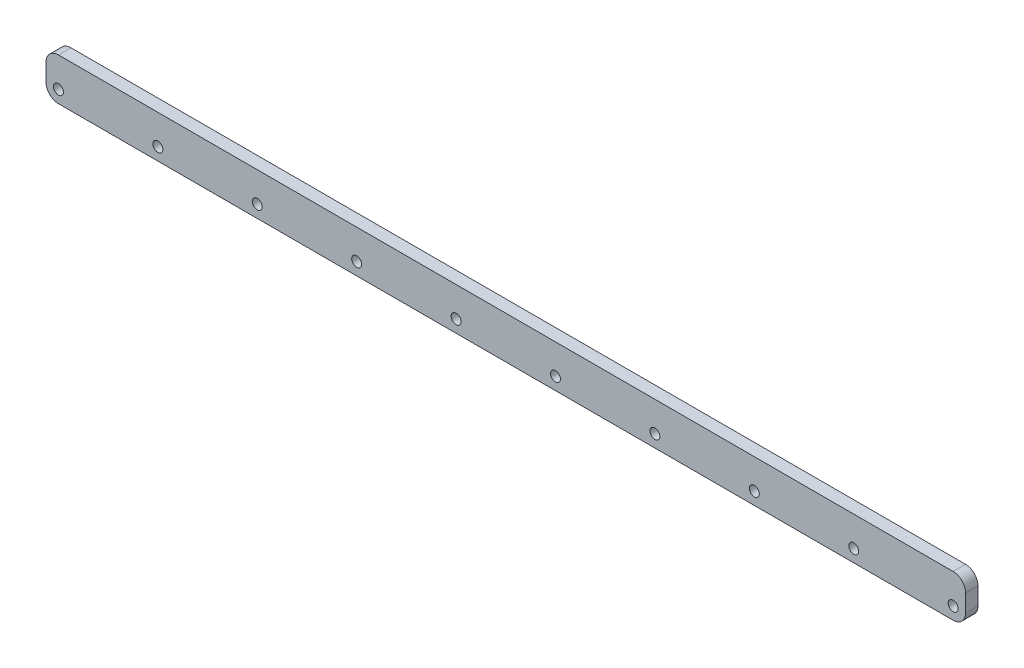
ISO-10303-21;
HEADER;
FILE_DESCRIPTION(('STEP AP214'),'2;1');
FILE_NAME('part.step','',(''),(''),'','','');
FILE_SCHEMA(('AUTOMOTIVE_DESIGN { 1 0 10303 214 1 1 1 1 }'));
ENDSEC;
DATA;
#1=APPLICATION_CONTEXT('core data for automotive mechanical design processes');
#2=APPLICATION_PROTOCOL_DEFINITION('international standard','automotive_design',2000,#1);
#3=PRODUCT_CONTEXT('',#1,'mechanical');
#4=PRODUCT('Part','Part','',(#3));
#5=PRODUCT_RELATED_PRODUCT_CATEGORY('part','',(#4));
#6=PRODUCT_DEFINITION_FORMATION('','',#4);
#7=PRODUCT_DEFINITION_CONTEXT('part definition',#1,'design');
#8=PRODUCT_DEFINITION('design','',#6,#7);
#9=PRODUCT_DEFINITION_SHAPE('','',#8);
#10=(LENGTH_UNIT() NAMED_UNIT(*) SI_UNIT(.MILLI.,.METRE.));
#11=(NAMED_UNIT(*) PLANE_ANGLE_UNIT() SI_UNIT($,.RADIAN.));
#12=(NAMED_UNIT(*) SI_UNIT($,.STERADIAN.) SOLID_ANGLE_UNIT());
#13=UNCERTAINTY_MEASURE_WITH_UNIT(LENGTH_MEASURE(1.E-05),#10,'distance_accuracy_value','');
#14=(GEOMETRIC_REPRESENTATION_CONTEXT(3) GLOBAL_UNCERTAINTY_ASSIGNED_CONTEXT((#13)) GLOBAL_UNIT_ASSIGNED_CONTEXT((#10,
#11,#12)) REPRESENTATION_CONTEXT('',''));
#15=CARTESIAN_POINT('',(0.,0.,0.));
#16=DIRECTION('',(0.,0.,1.));
#17=DIRECTION('',(1.,0.,0.));
#18=AXIS2_PLACEMENT_3D('',#15,#16,#17);
#19=CARTESIAN_POINT('',(0.,0.,5.));
#20=DIRECTION('',(0.,0.,-1.));
#21=DIRECTION('',(-1.,0.,0.));
#22=AXIS2_PLACEMENT_3D('',#19,#20,#21);
#23=PLANE('',#22);
#24=DIRECTION('',(1.,0.,0.));
#25=VECTOR('',#24,1.);
#26=CARTESIAN_POINT('',(0.,0.,5.));
#27=LINE('',#26,#25);
#28=CARTESIAN_POINT('',(5.,0.,5.));
#29=VERTEX_POINT('',#28);
#30=CARTESIAN_POINT('',(365.,0.,5.));
#31=VERTEX_POINT('',#30);
#32=EDGE_CURVE('E194',#29,#31,#27,.T.);
#33=ORIENTED_EDGE('',*,*,#32,.T.);
#34=CARTESIAN_POINT('',(365.,5.,5.));
#35=DIRECTION('',(0.,0.,-1.));
#36=DIRECTION('',(-1.,0.,0.));
#37=AXIS2_PLACEMENT_3D('',#34,#35,#36);
#38=CIRCLE('',#37,5.);
#39=CARTESIAN_POINT('',(370.,5.,5.));
#40=VERTEX_POINT('',#39);
#41=EDGE_CURVE('E156',#31,#40,#38,.F.);
#42=ORIENTED_EDGE('',*,*,#41,.T.);
#43=DIRECTION('',(0.,1.,0.));
#44=VECTOR('',#43,1.);
#45=CARTESIAN_POINT('',(370.,0.,5.));
#46=LINE('',#45,#44);
#47=CARTESIAN_POINT('',(370.,12.,5.));
#48=VERTEX_POINT('',#47);
#49=EDGE_CURVE('E123',#40,#48,#46,.T.);
#50=ORIENTED_EDGE('',*,*,#49,.T.);
#51=CARTESIAN_POINT('',(365.,12.,5.));
#52=DIRECTION('',(0.,0.,-1.));
#53=DIRECTION('',(-1.,0.,0.));
#54=AXIS2_PLACEMENT_3D('',#51,#52,#53);
#55=CIRCLE('',#54,5.);
#56=CARTESIAN_POINT('',(365.,17.,5.));
#57=VERTEX_POINT('',#56);
#58=EDGE_CURVE('E60',#48,#57,#55,.F.);
#59=ORIENTED_EDGE('',*,*,#58,.T.);
#60=DIRECTION('',(-1.,0.,0.));
#61=VECTOR('',#60,1.);
#62=CARTESIAN_POINT('',(0.,17.,5.));
#63=LINE('',#62,#61);
#64=CARTESIAN_POINT('',(5.,17.,5.));
#65=VERTEX_POINT('',#64);
#66=EDGE_CURVE('E139',#57,#65,#63,.T.);
#67=ORIENTED_EDGE('',*,*,#66,.T.);
#68=CARTESIAN_POINT('',(5.,12.,5.));
#69=DIRECTION('',(0.,0.,-1.));
#70=DIRECTION('',(-1.,0.,0.));
#71=AXIS2_PLACEMENT_3D('',#68,#69,#70);
#72=CIRCLE('',#71,5.);
#73=CARTESIAN_POINT('',(0.,12.,5.));
#74=VERTEX_POINT('',#73);
#75=EDGE_CURVE('E148',#65,#74,#72,.F.);
#76=ORIENTED_EDGE('',*,*,#75,.T.);
#77=DIRECTION('',(0.,-1.,0.));
#78=VECTOR('',#77,1.);
#79=CARTESIAN_POINT('',(0.,0.,5.));
#80=LINE('',#79,#78);
#81=CARTESIAN_POINT('',(0.,5.,5.));
#82=VERTEX_POINT('',#81);
#83=EDGE_CURVE('E133',#74,#82,#80,.T.);
#84=ORIENTED_EDGE('',*,*,#83,.T.);
#85=CARTESIAN_POINT('',(5.,5.,5.));
#86=DIRECTION('',(0.,0.,-1.));
#87=DIRECTION('',(-1.,0.,0.));
#88=AXIS2_PLACEMENT_3D('',#85,#86,#87);
#89=CIRCLE('',#88,5.);
#90=EDGE_CURVE('E151',#82,#29,#89,.F.);
#91=ORIENTED_EDGE('',*,*,#90,.T.);
#92=EDGE_LOOP('',(#33,#42,#50,#59,#67,#76,#84,#91));
#93=FACE_BOUND('',#92,.T.);
#94=CARTESIAN_POINT('',(5.,5.,5.));
#95=DIRECTION('',(0.,0.,1.));
#96=DIRECTION('',(1.,0.,0.));
#97=AXIS2_PLACEMENT_3D('',#94,#95,#96);
#98=CIRCLE('',#97,2.);
#99=CARTESIAN_POINT('',(7.,5.,5.));
#100=VERTEX_POINT('',#99);
#101=EDGE_CURVE('E173',#100,#100,#98,.T.);
#102=ORIENTED_EDGE('',*,*,#101,.F.);
#103=EDGE_LOOP('',(#102));
#104=FACE_BOUND('',#103,.T.);
#105=CARTESIAN_POINT('',(45.,5.,5.));
#106=DIRECTION('',(0.,0.,1.));
#107=DIRECTION('',(1.,0.,0.));
#108=AXIS2_PLACEMENT_3D('',#105,#106,#107);
#109=CIRCLE('',#108,2.);
#110=CARTESIAN_POINT('',(47.,5.,5.));
#111=VERTEX_POINT('',#110);
#112=EDGE_CURVE('E393',#111,#111,#109,.T.);
#113=ORIENTED_EDGE('',*,*,#112,.F.);
#114=EDGE_LOOP('',(#113));
#115=FACE_BOUND('',#114,.T.);
#116=CARTESIAN_POINT('',(85.,5.,5.));
#117=DIRECTION('',(0.,0.,1.));
#118=DIRECTION('',(1.,0.,0.));
#119=AXIS2_PLACEMENT_3D('',#116,#117,#118);
#120=CIRCLE('',#119,2.);
#121=CARTESIAN_POINT('',(87.,5.,5.));
#122=VERTEX_POINT('',#121);
#123=EDGE_CURVE('E401',#122,#122,#120,.T.);
#124=ORIENTED_EDGE('',*,*,#123,.F.);
#125=EDGE_LOOP('',(#124));
#126=FACE_BOUND('',#125,.T.);
#127=CARTESIAN_POINT('',(125.,5.,5.));
#128=DIRECTION('',(0.,0.,1.));
#129=DIRECTION('',(1.,0.,0.));
#130=AXIS2_PLACEMENT_3D('',#127,#128,#129);
#131=CIRCLE('',#130,2.);
#132=CARTESIAN_POINT('',(127.,5.,5.));
#133=VERTEX_POINT('',#132);
#134=EDGE_CURVE('E416',#133,#133,#131,.T.);
#135=ORIENTED_EDGE('',*,*,#134,.F.);
#136=EDGE_LOOP('',(#135));
#137=FACE_BOUND('',#136,.T.);
#138=CARTESIAN_POINT('',(165.,5.,5.));
#139=DIRECTION('',(0.,0.,1.));
#140=DIRECTION('',(1.,0.,0.));
#141=AXIS2_PLACEMENT_3D('',#138,#139,#140);
#142=CIRCLE('',#141,2.);
#143=CARTESIAN_POINT('',(167.,5.,5.));
#144=VERTEX_POINT('',#143);
#145=EDGE_CURVE('E417',#144,#144,#142,.T.);
#146=ORIENTED_EDGE('',*,*,#145,.F.);
#147=EDGE_LOOP('',(#146));
#148=FACE_BOUND('',#147,.T.);
#149=CARTESIAN_POINT('',(205.,5.,5.));
#150=DIRECTION('',(0.,0.,1.));
#151=DIRECTION('',(1.,0.,0.));
#152=AXIS2_PLACEMENT_3D('',#149,#150,#151);
#153=CIRCLE('',#152,2.);
#154=CARTESIAN_POINT('',(207.,5.,5.));
#155=VERTEX_POINT('',#154);
#156=EDGE_CURVE('E425',#155,#155,#153,.T.);
#157=ORIENTED_EDGE('',*,*,#156,.F.);
#158=EDGE_LOOP('',(#157));
#159=FACE_BOUND('',#158,.T.);
#160=CARTESIAN_POINT('',(245.,5.,5.));
#161=DIRECTION('',(0.,0.,1.));
#162=DIRECTION('',(1.,0.,0.));
#163=AXIS2_PLACEMENT_3D('',#160,#161,#162);
#164=CIRCLE('',#163,2.);
#165=CARTESIAN_POINT('',(247.,5.,5.));
#166=VERTEX_POINT('',#165);
#167=EDGE_CURVE('E442',#166,#166,#164,.T.);
#168=ORIENTED_EDGE('',*,*,#167,.F.);
#169=EDGE_LOOP('',(#168));
#170=FACE_BOUND('',#169,.T.);
#171=CARTESIAN_POINT('',(285.,5.,5.));
#172=DIRECTION('',(0.,0.,1.));
#173=DIRECTION('',(1.,0.,0.));
#174=AXIS2_PLACEMENT_3D('',#171,#172,#173);
#175=CIRCLE('',#174,2.);
#176=CARTESIAN_POINT('',(287.,5.,5.));
#177=VERTEX_POINT('',#176);
#178=EDGE_CURVE('E443',#177,#177,#175,.T.);
#179=ORIENTED_EDGE('',*,*,#178,.F.);
#180=EDGE_LOOP('',(#179));
#181=FACE_BOUND('',#180,.T.);
#182=CARTESIAN_POINT('',(325.,5.,5.));
#183=DIRECTION('',(0.,0.,1.));
#184=DIRECTION('',(1.,0.,0.));
#185=AXIS2_PLACEMENT_3D('',#182,#183,#184);
#186=CIRCLE('',#185,2.);
#187=CARTESIAN_POINT('',(327.,5.,5.));
#188=VERTEX_POINT('',#187);
#189=EDGE_CURVE('E451',#188,#188,#186,.T.);
#190=ORIENTED_EDGE('',*,*,#189,.F.);
#191=EDGE_LOOP('',(#190));
#192=FACE_BOUND('',#191,.T.);
#193=CARTESIAN_POINT('',(365.,5.,5.));
#194=DIRECTION('',(0.,0.,1.));
#195=DIRECTION('',(1.,0.,0.));
#196=AXIS2_PLACEMENT_3D('',#193,#194,#195);
#197=CIRCLE('',#196,2.);
#198=CARTESIAN_POINT('',(367.,5.,5.));
#199=VERTEX_POINT('',#198);
#200=EDGE_CURVE('E464',#199,#199,#197,.T.);
#201=ORIENTED_EDGE('',*,*,#200,.F.);
#202=EDGE_LOOP('',(#201));
#203=FACE_BOUND('',#202,.T.);
#204=ADVANCED_FACE('F38',(#93,#104,#115,#126,#137,#148,#159,#170,#181,#192,#203),#23,.F.);
#205=CARTESIAN_POINT('',(0.,0.,0.));
#206=DIRECTION('',(0.,0.,-1.));
#207=DIRECTION('',(-1.,0.,0.));
#208=AXIS2_PLACEMENT_3D('',#205,#206,#207);
#209=PLANE('',#208);
#210=CARTESIAN_POINT('',(325.,5.,0.));
#211=DIRECTION('',(0.,0.,1.));
#212=DIRECTION('',(1.,0.,0.));
#213=AXIS2_PLACEMENT_3D('',#210,#211,#212);
#214=CIRCLE('',#213,2.);
#215=CARTESIAN_POINT('',(327.,5.,0.));
#216=VERTEX_POINT('',#215);
#217=EDGE_CURVE('E456',#216,#216,#214,.T.);
#218=ORIENTED_EDGE('',*,*,#217,.T.);
#219=EDGE_LOOP('',(#218));
#220=FACE_BOUND('',#219,.T.);
#221=CARTESIAN_POINT('',(245.,5.,0.));
#222=DIRECTION('',(0.,0.,1.));
#223=DIRECTION('',(1.,0.,0.));
#224=AXIS2_PLACEMENT_3D('',#221,#222,#223);
#225=CIRCLE('',#224,2.);
#226=CARTESIAN_POINT('',(247.,5.,0.));
#227=VERTEX_POINT('',#226);
#228=EDGE_CURVE('E440',#227,#227,#225,.T.);
#229=ORIENTED_EDGE('',*,*,#228,.T.);
#230=EDGE_LOOP('',(#229));
#231=FACE_BOUND('',#230,.T.);
#232=CARTESIAN_POINT('',(165.,5.,0.));
#233=DIRECTION('',(0.,0.,1.));
#234=DIRECTION('',(1.,0.,0.));
#235=AXIS2_PLACEMENT_3D('',#232,#233,#234);
#236=CIRCLE('',#235,2.);
#237=CARTESIAN_POINT('',(167.,5.,0.));
#238=VERTEX_POINT('',#237);
#239=EDGE_CURVE('E422',#238,#238,#236,.T.);
#240=ORIENTED_EDGE('',*,*,#239,.T.);
#241=EDGE_LOOP('',(#240));
#242=FACE_BOUND('',#241,.T.);
#243=CARTESIAN_POINT('',(85.,5.,0.));
#244=DIRECTION('',(0.,0.,1.));
#245=DIRECTION('',(1.,0.,0.));
#246=AXIS2_PLACEMENT_3D('',#243,#244,#245);
#247=CIRCLE('',#246,2.);
#248=CARTESIAN_POINT('',(87.,5.,0.));
#249=VERTEX_POINT('',#248);
#250=EDGE_CURVE('E405',#249,#249,#247,.T.);
#251=ORIENTED_EDGE('',*,*,#250,.T.);
#252=EDGE_LOOP('',(#251));
#253=FACE_BOUND('',#252,.T.);
#254=CARTESIAN_POINT('',(5.,5.,0.));
#255=DIRECTION('',(0.,0.,1.));
#256=DIRECTION('',(1.,0.,0.));
#257=AXIS2_PLACEMENT_3D('',#254,#255,#256);
#258=CIRCLE('',#257,2.);
#259=CARTESIAN_POINT('',(7.,5.,0.));
#260=VERTEX_POINT('',#259);
#261=EDGE_CURVE('E176',#260,#260,#258,.T.);
#262=ORIENTED_EDGE('',*,*,#261,.T.);
#263=EDGE_LOOP('',(#262));
#264=FACE_BOUND('',#263,.T.);
#265=DIRECTION('',(0.,1.,0.));
#266=VECTOR('',#265,1.);
#267=CARTESIAN_POINT('',(370.,0.,0.));
#268=LINE('',#267,#266);
#269=CARTESIAN_POINT('',(370.,5.,0.));
#270=VERTEX_POINT('',#269);
#271=CARTESIAN_POINT('',(370.,12.,0.));
#272=VERTEX_POINT('',#271);
#273=EDGE_CURVE('E121',#270,#272,#268,.T.);
#274=ORIENTED_EDGE('',*,*,#273,.F.);
#275=CARTESIAN_POINT('',(365.,5.,0.));
#276=DIRECTION('',(0.,0.,-1.));
#277=DIRECTION('',(-1.,0.,0.));
#278=AXIS2_PLACEMENT_3D('',#275,#276,#277);
#279=CIRCLE('',#278,5.);
#280=CARTESIAN_POINT('',(365.,0.,0.));
#281=VERTEX_POINT('',#280);
#282=EDGE_CURVE('E104',#270,#281,#279,.T.);
#283=ORIENTED_EDGE('',*,*,#282,.T.);
#284=DIRECTION('',(1.,0.,0.));
#285=VECTOR('',#284,1.);
#286=CARTESIAN_POINT('',(0.,0.,0.));
#287=LINE('',#286,#285);
#288=CARTESIAN_POINT('',(5.,0.,0.));
#289=VERTEX_POINT('',#288);
#290=EDGE_CURVE('E131',#289,#281,#287,.T.);
#291=ORIENTED_EDGE('',*,*,#290,.F.);
#292=CARTESIAN_POINT('',(5.,5.,0.));
#293=DIRECTION('',(0.,0.,-1.));
#294=DIRECTION('',(-1.,0.,0.));
#295=AXIS2_PLACEMENT_3D('',#292,#293,#294);
#296=CIRCLE('',#295,5.);
#297=CARTESIAN_POINT('',(0.,5.,0.));
#298=VERTEX_POINT('',#297);
#299=EDGE_CURVE('E142',#289,#298,#296,.T.);
#300=ORIENTED_EDGE('',*,*,#299,.T.);
#301=DIRECTION('',(0.,-1.,0.));
#302=VECTOR('',#301,1.);
#303=CARTESIAN_POINT('',(0.,0.,0.));
#304=LINE('',#303,#302);
#305=CARTESIAN_POINT('',(0.,12.,0.));
#306=VERTEX_POINT('',#305);
#307=EDGE_CURVE('E135',#306,#298,#304,.T.);
#308=ORIENTED_EDGE('',*,*,#307,.F.);
#309=CARTESIAN_POINT('',(5.,12.,0.));
#310=DIRECTION('',(0.,0.,-1.));
#311=DIRECTION('',(-1.,0.,0.));
#312=AXIS2_PLACEMENT_3D('',#309,#310,#311);
#313=CIRCLE('',#312,5.);
#314=CARTESIAN_POINT('',(5.,17.,0.));
#315=VERTEX_POINT('',#314);
#316=EDGE_CURVE('E124',#306,#315,#313,.T.);
#317=ORIENTED_EDGE('',*,*,#316,.T.);
#318=DIRECTION('',(-1.,0.,0.));
#319=VECTOR('',#318,1.);
#320=CARTESIAN_POINT('',(0.,17.,0.));
#321=LINE('',#320,#319);
#322=CARTESIAN_POINT('',(365.,17.,0.));
#323=VERTEX_POINT('',#322);
#324=EDGE_CURVE('E130',#323,#315,#321,.T.);
#325=ORIENTED_EDGE('',*,*,#324,.F.);
#326=CARTESIAN_POINT('',(365.,12.,0.));
#327=DIRECTION('',(0.,0.,-1.));
#328=DIRECTION('',(-1.,0.,0.));
#329=AXIS2_PLACEMENT_3D('',#326,#327,#328);
#330=CIRCLE('',#329,5.);
#331=EDGE_CURVE('E115',#323,#272,#330,.T.);
#332=ORIENTED_EDGE('',*,*,#331,.T.);
#333=EDGE_LOOP('',(#274,#283,#291,#300,#308,#317,#325,#332));
#334=FACE_BOUND('',#333,.T.);
#335=CARTESIAN_POINT('',(45.,5.,0.));
#336=DIRECTION('',(0.,0.,1.));
#337=DIRECTION('',(1.,0.,0.));
#338=AXIS2_PLACEMENT_3D('',#335,#336,#337);
#339=CIRCLE('',#338,2.);
#340=CARTESIAN_POINT('',(47.,5.,0.));
#341=VERTEX_POINT('',#340);
#342=EDGE_CURVE('E396',#341,#341,#339,.T.);
#343=ORIENTED_EDGE('',*,*,#342,.T.);
#344=EDGE_LOOP('',(#343));
#345=FACE_BOUND('',#344,.T.);
#346=CARTESIAN_POINT('',(125.,5.,0.));
#347=DIRECTION('',(0.,0.,1.));
#348=DIRECTION('',(1.,0.,0.));
#349=AXIS2_PLACEMENT_3D('',#346,#347,#348);
#350=CIRCLE('',#349,2.);
#351=CARTESIAN_POINT('',(127.,5.,0.));
#352=VERTEX_POINT('',#351);
#353=EDGE_CURVE('E414',#352,#352,#350,.T.);
#354=ORIENTED_EDGE('',*,*,#353,.T.);
#355=EDGE_LOOP('',(#354));
#356=FACE_BOUND('',#355,.T.);
#357=CARTESIAN_POINT('',(205.,5.,0.));
#358=DIRECTION('',(0.,0.,1.));
#359=DIRECTION('',(1.,0.,0.));
#360=AXIS2_PLACEMENT_3D('',#357,#358,#359);
#361=CIRCLE('',#360,2.);
#362=CARTESIAN_POINT('',(207.,5.,0.));
#363=VERTEX_POINT('',#362);
#364=EDGE_CURVE('E430',#363,#363,#361,.T.);
#365=ORIENTED_EDGE('',*,*,#364,.T.);
#366=EDGE_LOOP('',(#365));
#367=FACE_BOUND('',#366,.T.);
#368=CARTESIAN_POINT('',(285.,5.,0.));
#369=DIRECTION('',(0.,0.,1.));
#370=DIRECTION('',(1.,0.,0.));
#371=AXIS2_PLACEMENT_3D('',#368,#369,#370);
#372=CIRCLE('',#371,2.);
#373=CARTESIAN_POINT('',(287.,5.,0.));
#374=VERTEX_POINT('',#373);
#375=EDGE_CURVE('E448',#374,#374,#372,.T.);
#376=ORIENTED_EDGE('',*,*,#375,.T.);
#377=EDGE_LOOP('',(#376));
#378=FACE_BOUND('',#377,.T.);
#379=CARTESIAN_POINT('',(365.,5.,0.));
#380=DIRECTION('',(0.,0.,1.));
#381=DIRECTION('',(1.,0.,0.));
#382=AXIS2_PLACEMENT_3D('',#379,#380,#381);
#383=CIRCLE('',#382,2.);
#384=CARTESIAN_POINT('',(367.,5.,0.));
#385=VERTEX_POINT('',#384);
#386=EDGE_CURVE('E462',#385,#385,#383,.T.);
#387=ORIENTED_EDGE('',*,*,#386,.T.);
#388=EDGE_LOOP('',(#387));
#389=FACE_BOUND('',#388,.T.);
#390=ADVANCED_FACE('F127',(#220,#231,#242,#253,#264,#334,#345,#356,#367,#378,#389),#209,.T.);
#391=CARTESIAN_POINT('',(0.,0.,5.));
#392=DIRECTION('',(1.,0.,0.));
#393=DIRECTION('',(0.,0.,-1.));
#394=AXIS2_PLACEMENT_3D('',#391,#392,#393);
#395=PLANE('',#394);
#396=ORIENTED_EDGE('',*,*,#307,.T.);
#397=DIRECTION('',(0.,0.,-1.));
#398=VECTOR('',#397,1.);
#399=CARTESIAN_POINT('',(0.,5.,5.));
#400=LINE('',#399,#398);
#401=EDGE_CURVE('E12',#298,#82,#400,.F.);
#402=ORIENTED_EDGE('',*,*,#401,.T.);
#403=ORIENTED_EDGE('',*,*,#83,.F.);
#404=DIRECTION('',(0.,0.,-1.));
#405=VECTOR('',#404,1.);
#406=CARTESIAN_POINT('',(0.,12.,5.));
#407=LINE('',#406,#405);
#408=EDGE_CURVE('E46',#74,#306,#407,.T.);
#409=ORIENTED_EDGE('',*,*,#408,.T.);
#410=EDGE_LOOP('',(#396,#402,#403,#409));
#411=FACE_BOUND('',#410,.T.);
#412=ADVANCED_FACE('F168',(#411),#395,.F.);
#413=CARTESIAN_POINT('',(0.,0.,5.));
#414=DIRECTION('',(0.,1.,0.));
#415=DIRECTION('',(0.,0.,1.));
#416=AXIS2_PLACEMENT_3D('',#413,#414,#415);
#417=PLANE('',#416);
#418=ORIENTED_EDGE('',*,*,#290,.T.);
#419=DIRECTION('',(0.,0.,-1.));
#420=VECTOR('',#419,1.);
#421=CARTESIAN_POINT('',(365.,0.,5.));
#422=LINE('',#421,#420);
#423=EDGE_CURVE('E109',#281,#31,#422,.F.);
#424=ORIENTED_EDGE('',*,*,#423,.T.);
#425=ORIENTED_EDGE('',*,*,#32,.F.);
#426=DIRECTION('',(0.,0.,-1.));
#427=VECTOR('',#426,1.);
#428=CARTESIAN_POINT('',(5.,0.,5.));
#429=LINE('',#428,#427);
#430=EDGE_CURVE('E114',#29,#289,#429,.T.);
#431=ORIENTED_EDGE('',*,*,#430,.T.);
#432=EDGE_LOOP('',(#418,#424,#425,#431));
#433=FACE_BOUND('',#432,.T.);
#434=ADVANCED_FACE('F226',(#433),#417,.F.);
#435=CARTESIAN_POINT('',(370.,0.,5.));
#436=DIRECTION('',(-1.,0.,0.));
#437=DIRECTION('',(0.,0.,1.));
#438=AXIS2_PLACEMENT_3D('',#435,#436,#437);
#439=PLANE('',#438);
#440=ORIENTED_EDGE('',*,*,#49,.F.);
#441=DIRECTION('',(0.,0.,-1.));
#442=VECTOR('',#441,1.);
#443=CARTESIAN_POINT('',(370.,5.,5.));
#444=LINE('',#443,#442);
#445=EDGE_CURVE('E108',#40,#270,#444,.T.);
#446=ORIENTED_EDGE('',*,*,#445,.T.);
#447=ORIENTED_EDGE('',*,*,#273,.T.);
#448=DIRECTION('',(0.,0.,-1.));
#449=VECTOR('',#448,1.);
#450=CARTESIAN_POINT('',(370.,12.,5.));
#451=LINE('',#450,#449);
#452=EDGE_CURVE('E125',#272,#48,#451,.F.);
#453=ORIENTED_EDGE('',*,*,#452,.T.);
#454=EDGE_LOOP('',(#440,#446,#447,#453));
#455=FACE_BOUND('',#454,.T.);
#456=ADVANCED_FACE('F120',(#455),#439,.F.);
#457=CARTESIAN_POINT('',(0.,17.,5.));
#458=DIRECTION('',(0.,-1.,0.));
#459=DIRECTION('',(0.,0.,-1.));
#460=AXIS2_PLACEMENT_3D('',#457,#458,#459);
#461=PLANE('',#460);
#462=ORIENTED_EDGE('',*,*,#66,.F.);
#463=DIRECTION('',(0.,0.,-1.));
#464=VECTOR('',#463,1.);
#465=CARTESIAN_POINT('',(365.,17.,5.));
#466=LINE('',#465,#464);
#467=EDGE_CURVE('E160',#57,#323,#466,.T.);
#468=ORIENTED_EDGE('',*,*,#467,.T.);
#469=ORIENTED_EDGE('',*,*,#324,.T.);
#470=DIRECTION('',(0.,0.,-1.));
#471=VECTOR('',#470,1.);
#472=CARTESIAN_POINT('',(5.,17.,5.));
#473=LINE('',#472,#471);
#474=EDGE_CURVE('E53',#315,#65,#473,.F.);
#475=ORIENTED_EDGE('',*,*,#474,.T.);
#476=EDGE_LOOP('',(#462,#468,#469,#475));
#477=FACE_BOUND('',#476,.T.);
#478=ADVANCED_FACE('F204',(#477),#461,.F.);
#479=CARTESIAN_POINT('',(5.,5.,5.));
#480=DIRECTION('',(0.,0.,-1.));
#481=DIRECTION('',(-1.,0.,0.));
#482=AXIS2_PLACEMENT_3D('',#479,#480,#481);
#483=CYLINDRICAL_SURFACE('',#482,2.);
#484=ORIENTED_EDGE('',*,*,#101,.T.);
#485=EDGE_LOOP('',(#484));
#486=FACE_BOUND('',#485,.T.);
#487=ORIENTED_EDGE('',*,*,#261,.F.);
#488=EDGE_LOOP('',(#487));
#489=FACE_BOUND('',#488,.T.);
#490=ADVANCED_FACE('F219',(#486,#489),#483,.F.);
#491=CARTESIAN_POINT('',(45.,5.,5.));
#492=DIRECTION('',(0.,0.,-1.));
#493=DIRECTION('',(-1.,0.,0.));
#494=AXIS2_PLACEMENT_3D('',#491,#492,#493);
#495=CYLINDRICAL_SURFACE('',#494,2.);
#496=ORIENTED_EDGE('',*,*,#112,.T.);
#497=EDGE_LOOP('',(#496));
#498=FACE_BOUND('',#497,.T.);
#499=ORIENTED_EDGE('',*,*,#342,.F.);
#500=EDGE_LOOP('',(#499));
#501=FACE_BOUND('',#500,.T.);
#502=ADVANCED_FACE('F328',(#498,#501),#495,.F.);
#503=CARTESIAN_POINT('',(85.,5.,5.));
#504=DIRECTION('',(0.,0.,-1.));
#505=DIRECTION('',(-1.,0.,0.));
#506=AXIS2_PLACEMENT_3D('',#503,#504,#505);
#507=CYLINDRICAL_SURFACE('',#506,2.);
#508=ORIENTED_EDGE('',*,*,#123,.T.);
#509=EDGE_LOOP('',(#508));
#510=FACE_BOUND('',#509,.T.);
#511=ORIENTED_EDGE('',*,*,#250,.F.);
#512=EDGE_LOOP('',(#511));
#513=FACE_BOUND('',#512,.T.);
#514=ADVANCED_FACE('F319',(#510,#513),#507,.F.);
#515=CARTESIAN_POINT('',(125.,5.,5.));
#516=DIRECTION('',(0.,0.,-1.));
#517=DIRECTION('',(-1.,0.,0.));
#518=AXIS2_PLACEMENT_3D('',#515,#516,#517);
#519=CYLINDRICAL_SURFACE('',#518,2.);
#520=ORIENTED_EDGE('',*,*,#134,.T.);
#521=EDGE_LOOP('',(#520));
#522=FACE_BOUND('',#521,.T.);
#523=ORIENTED_EDGE('',*,*,#353,.F.);
#524=EDGE_LOOP('',(#523));
#525=FACE_BOUND('',#524,.T.);
#526=ADVANCED_FACE('F310',(#522,#525),#519,.F.);
#527=CARTESIAN_POINT('',(165.,5.,5.));
#528=DIRECTION('',(0.,0.,-1.));
#529=DIRECTION('',(-1.,0.,0.));
#530=AXIS2_PLACEMENT_3D('',#527,#528,#529);
#531=CYLINDRICAL_SURFACE('',#530,2.);
#532=ORIENTED_EDGE('',*,*,#145,.T.);
#533=EDGE_LOOP('',(#532));
#534=FACE_BOUND('',#533,.T.);
#535=ORIENTED_EDGE('',*,*,#239,.F.);
#536=EDGE_LOOP('',(#535));
#537=FACE_BOUND('',#536,.T.);
#538=ADVANCED_FACE('F301',(#534,#537),#531,.F.);
#539=CARTESIAN_POINT('',(205.,5.,5.));
#540=DIRECTION('',(0.,0.,-1.));
#541=DIRECTION('',(-1.,0.,0.));
#542=AXIS2_PLACEMENT_3D('',#539,#540,#541);
#543=CYLINDRICAL_SURFACE('',#542,2.);
#544=ORIENTED_EDGE('',*,*,#156,.T.);
#545=EDGE_LOOP('',(#544));
#546=FACE_BOUND('',#545,.T.);
#547=ORIENTED_EDGE('',*,*,#364,.F.);
#548=EDGE_LOOP('',(#547));
#549=FACE_BOUND('',#548,.T.);
#550=ADVANCED_FACE('F292',(#546,#549),#543,.F.);
#551=CARTESIAN_POINT('',(245.,5.,5.));
#552=DIRECTION('',(0.,0.,-1.));
#553=DIRECTION('',(-1.,0.,0.));
#554=AXIS2_PLACEMENT_3D('',#551,#552,#553);
#555=CYLINDRICAL_SURFACE('',#554,2.);
#556=ORIENTED_EDGE('',*,*,#167,.T.);
#557=EDGE_LOOP('',(#556));
#558=FACE_BOUND('',#557,.T.);
#559=ORIENTED_EDGE('',*,*,#228,.F.);
#560=EDGE_LOOP('',(#559));
#561=FACE_BOUND('',#560,.T.);
#562=ADVANCED_FACE('F283',(#558,#561),#555,.F.);
#563=CARTESIAN_POINT('',(285.,5.,5.));
#564=DIRECTION('',(0.,0.,-1.));
#565=DIRECTION('',(-1.,0.,0.));
#566=AXIS2_PLACEMENT_3D('',#563,#564,#565);
#567=CYLINDRICAL_SURFACE('',#566,2.);
#568=ORIENTED_EDGE('',*,*,#178,.T.);
#569=EDGE_LOOP('',(#568));
#570=FACE_BOUND('',#569,.T.);
#571=ORIENTED_EDGE('',*,*,#375,.F.);
#572=EDGE_LOOP('',(#571));
#573=FACE_BOUND('',#572,.T.);
#574=ADVANCED_FACE('F274',(#570,#573),#567,.F.);
#575=CARTESIAN_POINT('',(325.,5.,5.));
#576=DIRECTION('',(0.,0.,-1.));
#577=DIRECTION('',(-1.,0.,0.));
#578=AXIS2_PLACEMENT_3D('',#575,#576,#577);
#579=CYLINDRICAL_SURFACE('',#578,2.);
#580=ORIENTED_EDGE('',*,*,#189,.T.);
#581=EDGE_LOOP('',(#580));
#582=FACE_BOUND('',#581,.T.);
#583=ORIENTED_EDGE('',*,*,#217,.F.);
#584=EDGE_LOOP('',(#583));
#585=FACE_BOUND('',#584,.T.);
#586=ADVANCED_FACE('F265',(#582,#585),#579,.F.);
#587=CARTESIAN_POINT('',(365.,5.,5.));
#588=DIRECTION('',(0.,0.,-1.));
#589=DIRECTION('',(-1.,0.,0.));
#590=AXIS2_PLACEMENT_3D('',#587,#588,#589);
#591=CYLINDRICAL_SURFACE('',#590,2.);
#592=ORIENTED_EDGE('',*,*,#200,.T.);
#593=EDGE_LOOP('',(#592));
#594=FACE_BOUND('',#593,.T.);
#595=ORIENTED_EDGE('',*,*,#386,.F.);
#596=EDGE_LOOP('',(#595));
#597=FACE_BOUND('',#596,.T.);
#598=ADVANCED_FACE('F234',(#594,#597),#591,.F.);
#599=CARTESIAN_POINT('',(365.,5.,5.));
#600=DIRECTION('',(0.,0.,-1.));
#601=DIRECTION('',(-1.,0.,0.));
#602=AXIS2_PLACEMENT_3D('',#599,#600,#601);
#603=CYLINDRICAL_SURFACE('',#602,5.);
#604=ORIENTED_EDGE('',*,*,#41,.F.);
#605=ORIENTED_EDGE('',*,*,#423,.F.);
#606=ORIENTED_EDGE('',*,*,#282,.F.);
#607=ORIENTED_EDGE('',*,*,#445,.F.);
#608=EDGE_LOOP('',(#604,#605,#606,#607));
#609=FACE_BOUND('',#608,.T.);
#610=ADVANCED_FACE('F107',(#609),#603,.T.);
#611=CARTESIAN_POINT('',(365.,12.,5.));
#612=DIRECTION('',(0.,0.,-1.));
#613=DIRECTION('',(-1.,0.,0.));
#614=AXIS2_PLACEMENT_3D('',#611,#612,#613);
#615=CYLINDRICAL_SURFACE('',#614,5.);
#616=ORIENTED_EDGE('',*,*,#58,.F.);
#617=ORIENTED_EDGE('',*,*,#452,.F.);
#618=ORIENTED_EDGE('',*,*,#331,.F.);
#619=ORIENTED_EDGE('',*,*,#467,.F.);
#620=EDGE_LOOP('',(#616,#617,#618,#619));
#621=FACE_BOUND('',#620,.T.);
#622=ADVANCED_FACE('F203',(#621),#615,.T.);
#623=CARTESIAN_POINT('',(5.,5.,5.));
#624=DIRECTION('',(0.,0.,-1.));
#625=DIRECTION('',(-1.,0.,0.));
#626=AXIS2_PLACEMENT_3D('',#623,#624,#625);
#627=CYLINDRICAL_SURFACE('',#626,5.);
#628=ORIENTED_EDGE('',*,*,#90,.F.);
#629=ORIENTED_EDGE('',*,*,#401,.F.);
#630=ORIENTED_EDGE('',*,*,#299,.F.);
#631=ORIENTED_EDGE('',*,*,#430,.F.);
#632=EDGE_LOOP('',(#628,#629,#630,#631));
#633=FACE_BOUND('',#632,.T.);
#634=ADVANCED_FACE('F206',(#633),#627,.T.);
#635=CARTESIAN_POINT('',(5.,12.,5.));
#636=DIRECTION('',(0.,0.,-1.));
#637=DIRECTION('',(-1.,0.,0.));
#638=AXIS2_PLACEMENT_3D('',#635,#636,#637);
#639=CYLINDRICAL_SURFACE('',#638,5.);
#640=ORIENTED_EDGE('',*,*,#75,.F.);
#641=ORIENTED_EDGE('',*,*,#474,.F.);
#642=ORIENTED_EDGE('',*,*,#316,.F.);
#643=ORIENTED_EDGE('',*,*,#408,.F.);
#644=EDGE_LOOP('',(#640,#641,#642,#643));
#645=FACE_BOUND('',#644,.T.);
#646=ADVANCED_FACE('F40',(#645),#639,.T.);
#647=CLOSED_SHELL('',(#204,#390,#412,#434,#456,#478,#490,#502,#514,#526,#538,#550,#562,#574,
#586,#598,#610,#622,#634,#646));
#648=MANIFOLD_SOLID_BREP('B2',#647);
#649=ADVANCED_BREP_SHAPE_REPRESENTATION('',(#18,#648),#14);
#650=SHAPE_DEFINITION_REPRESENTATION(#9,#649);
ENDSEC;
END-ISO-10303-21;
